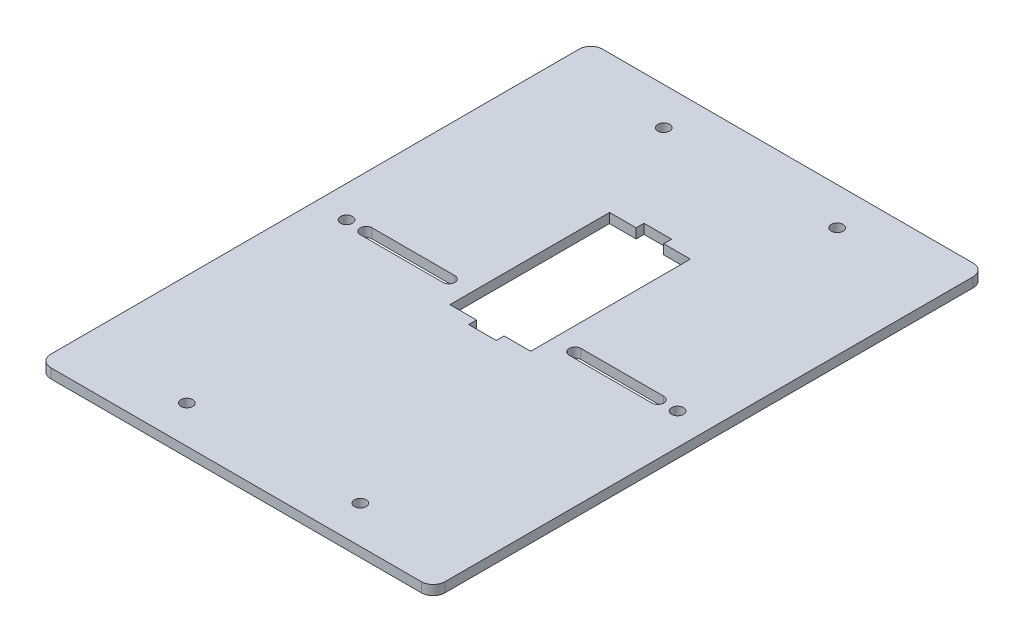
ISO-10303-21;
HEADER;
FILE_DESCRIPTION(('STEP AP214'),'2;1');
FILE_NAME('part.step','',(''),(''),'','','');
FILE_SCHEMA(('AUTOMOTIVE_DESIGN { 1 0 10303 214 1 1 1 1 }'));
ENDSEC;
DATA;
#1=APPLICATION_CONTEXT('core data for automotive mechanical design processes');
#2=APPLICATION_PROTOCOL_DEFINITION('international standard','automotive_design',2000,#1);
#3=PRODUCT_CONTEXT('',#1,'mechanical');
#4=PRODUCT('Part','Part','',(#3));
#5=PRODUCT_RELATED_PRODUCT_CATEGORY('part','',(#4));
#6=PRODUCT_DEFINITION_FORMATION('','',#4);
#7=PRODUCT_DEFINITION_CONTEXT('part definition',#1,'design');
#8=PRODUCT_DEFINITION('design','',#6,#7);
#9=PRODUCT_DEFINITION_SHAPE('','',#8);
#10=(LENGTH_UNIT() NAMED_UNIT(*) SI_UNIT(.MILLI.,.METRE.));
#11=(NAMED_UNIT(*) PLANE_ANGLE_UNIT() SI_UNIT($,.RADIAN.));
#12=(NAMED_UNIT(*) SI_UNIT($,.STERADIAN.) SOLID_ANGLE_UNIT());
#13=UNCERTAINTY_MEASURE_WITH_UNIT(LENGTH_MEASURE(1.E-05),#10,'distance_accuracy_value','');
#14=(GEOMETRIC_REPRESENTATION_CONTEXT(3) GLOBAL_UNCERTAINTY_ASSIGNED_CONTEXT((#13)) GLOBAL_UNIT_ASSIGNED_CONTEXT((#10,
#11,#12)) REPRESENTATION_CONTEXT('',''));
#15=CARTESIAN_POINT('',(0.,0.,0.));
#16=DIRECTION('',(0.,0.,1.));
#17=DIRECTION('',(1.,0.,0.));
#18=AXIS2_PLACEMENT_3D('',#15,#16,#17);
#19=CARTESIAN_POINT('',(47.,-2.45,67.));
#20=DIRECTION('',(0.,1.,0.));
#21=DIRECTION('',(0.,0.,1.));
#22=AXIS2_PLACEMENT_3D('',#19,#20,#21);
#23=CYLINDRICAL_SURFACE('',#22,3.);
#24=CARTESIAN_POINT('',(47.,0.,67.));
#25=DIRECTION('',(0.,1.,0.));
#26=DIRECTION('',(0.,0.,1.));
#27=AXIS2_PLACEMENT_3D('',#24,#25,#26);
#28=CIRCLE('',#27,3.);
#29=CARTESIAN_POINT('',(47.,0.,70.));
#30=VERTEX_POINT('',#29);
#31=CARTESIAN_POINT('',(50.,0.,67.));
#32=VERTEX_POINT('',#31);
#33=EDGE_CURVE('E393',#30,#32,#28,.T.);
#34=ORIENTED_EDGE('',*,*,#33,.F.);
#35=DIRECTION('',(0.,1.,0.));
#36=VECTOR('',#35,1.);
#37=CARTESIAN_POINT('',(47.,-2.45,70.));
#38=LINE('',#37,#36);
#39=CARTESIAN_POINT('',(47.,-2.45,70.));
#40=VERTEX_POINT('',#39);
#41=EDGE_CURVE('E11',#40,#30,#38,.T.);
#42=ORIENTED_EDGE('',*,*,#41,.F.);
#43=CARTESIAN_POINT('',(47.,-2.45,67.));
#44=DIRECTION('',(0.,1.,0.));
#45=DIRECTION('',(0.,0.,1.));
#46=AXIS2_PLACEMENT_3D('',#43,#44,#45);
#47=CIRCLE('',#46,3.);
#48=CARTESIAN_POINT('',(50.,-2.45,67.));
#49=VERTEX_POINT('',#48);
#50=EDGE_CURVE('E416',#40,#49,#47,.T.);
#51=ORIENTED_EDGE('',*,*,#50,.T.);
#52=DIRECTION('',(0.,1.,0.));
#53=VECTOR('',#52,1.);
#54=CARTESIAN_POINT('',(50.,-2.45,67.));
#55=LINE('',#54,#53);
#56=EDGE_CURVE('E39',#49,#32,#55,.T.);
#57=ORIENTED_EDGE('',*,*,#56,.T.);
#58=EDGE_LOOP('',(#34,#42,#51,#57));
#59=FACE_BOUND('',#58,.T.);
#60=ADVANCED_FACE('F36',(#59),#23,.T.);
#61=CARTESIAN_POINT('',(-47.,-2.45,70.));
#62=DIRECTION('',(0.,0.,1.));
#63=DIRECTION('',(1.,0.,0.));
#64=AXIS2_PLACEMENT_3D('',#61,#62,#63);
#65=PLANE('',#64);
#66=DIRECTION('',(1.,0.,0.));
#67=VECTOR('',#66,1.);
#68=CARTESIAN_POINT('',(-47.,0.,70.));
#69=LINE('',#68,#67);
#70=CARTESIAN_POINT('',(-47.,0.,70.));
#71=VERTEX_POINT('',#70);
#72=EDGE_CURVE('E420',#71,#30,#69,.T.);
#73=ORIENTED_EDGE('',*,*,#72,.F.);
#74=DIRECTION('',(0.,1.,0.));
#75=VECTOR('',#74,1.);
#76=CARTESIAN_POINT('',(-47.,-2.45,70.));
#77=LINE('',#76,#75);
#78=CARTESIAN_POINT('',(-47.,-2.45,70.));
#79=VERTEX_POINT('',#78);
#80=EDGE_CURVE('E44',#79,#71,#77,.T.);
#81=ORIENTED_EDGE('',*,*,#80,.F.);
#82=DIRECTION('',(1.,0.,0.));
#83=VECTOR('',#82,1.);
#84=CARTESIAN_POINT('',(-47.,-2.45,70.));
#85=LINE('',#84,#83);
#86=EDGE_CURVE('E438',#79,#40,#85,.T.);
#87=ORIENTED_EDGE('',*,*,#86,.T.);
#88=ORIENTED_EDGE('',*,*,#41,.T.);
#89=EDGE_LOOP('',(#73,#81,#87,#88));
#90=FACE_BOUND('',#89,.T.);
#91=ADVANCED_FACE('F485',(#90),#65,.T.);
#92=CARTESIAN_POINT('',(-47.,-2.45,67.));
#93=DIRECTION('',(0.,1.,0.));
#94=DIRECTION('',(0.,0.,1.));
#95=AXIS2_PLACEMENT_3D('',#92,#93,#94);
#96=CYLINDRICAL_SURFACE('',#95,3.);
#97=CARTESIAN_POINT('',(-47.,0.,67.));
#98=DIRECTION('',(0.,1.,0.));
#99=DIRECTION('',(0.,0.,-1.));
#100=AXIS2_PLACEMENT_3D('',#97,#98,#99);
#101=CIRCLE('',#100,3.);
#102=CARTESIAN_POINT('',(-50.,0.,67.));
#103=VERTEX_POINT('',#102);
#104=EDGE_CURVE('E458',#103,#71,#101,.T.);
#105=ORIENTED_EDGE('',*,*,#104,.F.);
#106=DIRECTION('',(0.,1.,0.));
#107=VECTOR('',#106,1.);
#108=CARTESIAN_POINT('',(-50.,-2.45,67.));
#109=LINE('',#108,#107);
#110=CARTESIAN_POINT('',(-50.,-2.45,67.));
#111=VERTEX_POINT('',#110);
#112=EDGE_CURVE('E464',#111,#103,#109,.T.);
#113=ORIENTED_EDGE('',*,*,#112,.F.);
#114=CARTESIAN_POINT('',(-47.,-2.45,67.));
#115=DIRECTION('',(0.,1.,0.));
#116=DIRECTION('',(0.,0.,-1.));
#117=AXIS2_PLACEMENT_3D('',#114,#115,#116);
#118=CIRCLE('',#117,3.);
#119=EDGE_CURVE('E435',#111,#79,#118,.T.);
#120=ORIENTED_EDGE('',*,*,#119,.T.);
#121=ORIENTED_EDGE('',*,*,#80,.T.);
#122=EDGE_LOOP('',(#105,#113,#120,#121));
#123=FACE_BOUND('',#122,.T.);
#124=ADVANCED_FACE('F505',(#123),#96,.T.);
#125=CARTESIAN_POINT('',(-50.,-2.45,67.));
#126=DIRECTION('',(-1.,0.,0.));
#127=DIRECTION('',(0.,0.,1.));
#128=AXIS2_PLACEMENT_3D('',#125,#126,#127);
#129=PLANE('',#128);
#130=DIRECTION('',(0.,0.,1.));
#131=VECTOR('',#130,1.);
#132=CARTESIAN_POINT('',(-50.,0.,67.));
#133=LINE('',#132,#131);
#134=CARTESIAN_POINT('',(-50.,0.,-67.));
#135=VERTEX_POINT('',#134);
#136=EDGE_CURVE('E455',#135,#103,#133,.T.);
#137=ORIENTED_EDGE('',*,*,#136,.F.);
#138=DIRECTION('',(0.,1.,0.));
#139=VECTOR('',#138,1.);
#140=CARTESIAN_POINT('',(-50.,-2.45,-67.));
#141=LINE('',#140,#139);
#142=CARTESIAN_POINT('',(-50.,-2.45,-67.));
#143=VERTEX_POINT('',#142);
#144=EDGE_CURVE('E466',#143,#135,#141,.T.);
#145=ORIENTED_EDGE('',*,*,#144,.F.);
#146=DIRECTION('',(0.,0.,1.));
#147=VECTOR('',#146,1.);
#148=CARTESIAN_POINT('',(-50.,-2.45,67.));
#149=LINE('',#148,#147);
#150=EDGE_CURVE('E432',#143,#111,#149,.T.);
#151=ORIENTED_EDGE('',*,*,#150,.T.);
#152=ORIENTED_EDGE('',*,*,#112,.T.);
#153=EDGE_LOOP('',(#137,#145,#151,#152));
#154=FACE_BOUND('',#153,.T.);
#155=ADVANCED_FACE('F503',(#154),#129,.T.);
#156=CARTESIAN_POINT('',(-47.,-2.45,-67.));
#157=DIRECTION('',(0.,1.,0.));
#158=DIRECTION('',(0.,0.,1.));
#159=AXIS2_PLACEMENT_3D('',#156,#157,#158);
#160=CYLINDRICAL_SURFACE('',#159,3.);
#161=CARTESIAN_POINT('',(-47.,0.,-67.));
#162=DIRECTION('',(0.,1.,0.));
#163=DIRECTION('',(0.,0.,-1.));
#164=AXIS2_PLACEMENT_3D('',#161,#162,#163);
#165=CIRCLE('',#164,3.);
#166=CARTESIAN_POINT('',(-47.,0.,-70.));
#167=VERTEX_POINT('',#166);
#168=EDGE_CURVE('E452',#167,#135,#165,.T.);
#169=ORIENTED_EDGE('',*,*,#168,.F.);
#170=DIRECTION('',(0.,1.,0.));
#171=VECTOR('',#170,1.);
#172=CARTESIAN_POINT('',(-47.,-2.45,-70.));
#173=LINE('',#172,#171);
#174=CARTESIAN_POINT('',(-47.,-2.45,-70.));
#175=VERTEX_POINT('',#174);
#176=EDGE_CURVE('E468',#175,#167,#173,.T.);
#177=ORIENTED_EDGE('',*,*,#176,.F.);
#178=CARTESIAN_POINT('',(-47.,-2.45,-67.));
#179=DIRECTION('',(0.,1.,0.));
#180=DIRECTION('',(0.,0.,-1.));
#181=AXIS2_PLACEMENT_3D('',#178,#179,#180);
#182=CIRCLE('',#181,3.);
#183=EDGE_CURVE('E429',#175,#143,#182,.T.);
#184=ORIENTED_EDGE('',*,*,#183,.T.);
#185=ORIENTED_EDGE('',*,*,#144,.T.);
#186=EDGE_LOOP('',(#169,#177,#184,#185));
#187=FACE_BOUND('',#186,.T.);
#188=ADVANCED_FACE('F499',(#187),#160,.T.);
#189=CARTESIAN_POINT('',(-47.,-2.45,-70.));
#190=DIRECTION('',(0.,0.,-1.));
#191=DIRECTION('',(-1.,0.,0.));
#192=AXIS2_PLACEMENT_3D('',#189,#190,#191);
#193=PLANE('',#192);
#194=DIRECTION('',(-1.,0.,0.));
#195=VECTOR('',#194,1.);
#196=CARTESIAN_POINT('',(-47.,0.,-70.));
#197=LINE('',#196,#195);
#198=CARTESIAN_POINT('',(47.,0.,-70.));
#199=VERTEX_POINT('',#198);
#200=EDGE_CURVE('E449',#199,#167,#197,.T.);
#201=ORIENTED_EDGE('',*,*,#200,.F.);
#202=DIRECTION('',(0.,1.,0.));
#203=VECTOR('',#202,1.);
#204=CARTESIAN_POINT('',(47.,-2.45,-70.));
#205=LINE('',#204,#203);
#206=CARTESIAN_POINT('',(47.,-2.45,-70.));
#207=VERTEX_POINT('',#206);
#208=EDGE_CURVE('E470',#207,#199,#205,.T.);
#209=ORIENTED_EDGE('',*,*,#208,.F.);
#210=DIRECTION('',(-1.,0.,0.));
#211=VECTOR('',#210,1.);
#212=CARTESIAN_POINT('',(-47.,-2.45,-70.));
#213=LINE('',#212,#211);
#214=EDGE_CURVE('E426',#207,#175,#213,.T.);
#215=ORIENTED_EDGE('',*,*,#214,.T.);
#216=ORIENTED_EDGE('',*,*,#176,.T.);
#217=EDGE_LOOP('',(#201,#209,#215,#216));
#218=FACE_BOUND('',#217,.T.);
#219=ADVANCED_FACE('F497',(#218),#193,.T.);
#220=CARTESIAN_POINT('',(47.,-2.45,-67.));
#221=DIRECTION('',(0.,1.,0.));
#222=DIRECTION('',(0.,0.,1.));
#223=AXIS2_PLACEMENT_3D('',#220,#221,#222);
#224=CYLINDRICAL_SURFACE('',#223,3.);
#225=CARTESIAN_POINT('',(47.,0.,-67.));
#226=DIRECTION('',(0.,1.,0.));
#227=DIRECTION('',(0.,0.,-1.));
#228=AXIS2_PLACEMENT_3D('',#225,#226,#227);
#229=CIRCLE('',#228,3.);
#230=CARTESIAN_POINT('',(50.,0.,-67.));
#231=VERTEX_POINT('',#230);
#232=EDGE_CURVE('E446',#231,#199,#229,.T.);
#233=ORIENTED_EDGE('',*,*,#232,.F.);
#234=DIRECTION('',(0.,1.,0.));
#235=VECTOR('',#234,1.);
#236=CARTESIAN_POINT('',(50.,-2.45,-67.));
#237=LINE('',#236,#235);
#238=CARTESIAN_POINT('',(50.,-2.45,-67.));
#239=VERTEX_POINT('',#238);
#240=EDGE_CURVE('E471',#239,#231,#237,.T.);
#241=ORIENTED_EDGE('',*,*,#240,.F.);
#242=CARTESIAN_POINT('',(47.,-2.45,-67.));
#243=DIRECTION('',(0.,1.,0.));
#244=DIRECTION('',(0.,0.,-1.));
#245=AXIS2_PLACEMENT_3D('',#242,#243,#244);
#246=CIRCLE('',#245,3.);
#247=EDGE_CURVE('E423',#239,#207,#246,.T.);
#248=ORIENTED_EDGE('',*,*,#247,.T.);
#249=ORIENTED_EDGE('',*,*,#208,.T.);
#250=EDGE_LOOP('',(#233,#241,#248,#249));
#251=FACE_BOUND('',#250,.T.);
#252=ADVANCED_FACE('F493',(#251),#224,.T.);
#253=CARTESIAN_POINT('',(50.,-2.45,67.));
#254=DIRECTION('',(1.,0.,0.));
#255=DIRECTION('',(0.,0.,-1.));
#256=AXIS2_PLACEMENT_3D('',#253,#254,#255);
#257=PLANE('',#256);
#258=DIRECTION('',(0.,0.,-1.));
#259=VECTOR('',#258,1.);
#260=CARTESIAN_POINT('',(50.,0.,67.));
#261=LINE('',#260,#259);
#262=EDGE_CURVE('E443',#32,#231,#261,.T.);
#263=ORIENTED_EDGE('',*,*,#262,.F.);
#264=ORIENTED_EDGE('',*,*,#56,.F.);
#265=DIRECTION('',(0.,0.,-1.));
#266=VECTOR('',#265,1.);
#267=CARTESIAN_POINT('',(50.,-2.45,67.));
#268=LINE('',#267,#266);
#269=EDGE_CURVE('E419',#49,#239,#268,.T.);
#270=ORIENTED_EDGE('',*,*,#269,.T.);
#271=ORIENTED_EDGE('',*,*,#240,.T.);
#272=EDGE_LOOP('',(#263,#264,#270,#271));
#273=FACE_BOUND('',#272,.T.);
#274=ADVANCED_FACE('F479',(#273),#257,.T.);
#275=CARTESIAN_POINT('',(47.,-2.45,67.));
#276=DIRECTION('',(0.,1.,0.));
#277=DIRECTION('',(0.,0.,1.));
#278=AXIS2_PLACEMENT_3D('',#275,#276,#277);
#279=PLANE('',#278);
#280=CARTESIAN_POINT('',(42.,-2.45,0.));
#281=DIRECTION('',(0.,1.,0.));
#282=DIRECTION('',(0.,0.,1.));
#283=AXIS2_PLACEMENT_3D('',#280,#281,#282);
#284=CIRCLE('',#283,1.5);
#285=CARTESIAN_POINT('',(42.,-2.45,1.5));
#286=VERTEX_POINT('',#285);
#287=EDGE_CURVE('E294',#286,#286,#284,.T.);
#288=ORIENTED_EDGE('',*,*,#287,.T.);
#289=EDGE_LOOP('',(#288));
#290=FACE_BOUND('',#289,.T.);
#291=CARTESIAN_POINT('',(-42.,-2.45,0.));
#292=DIRECTION('',(0.,1.,0.));
#293=DIRECTION('',(0.,0.,1.));
#294=AXIS2_PLACEMENT_3D('',#291,#292,#293);
#295=CIRCLE('',#294,1.5);
#296=CARTESIAN_POINT('',(-42.,-2.45,1.5));
#297=VERTEX_POINT('',#296);
#298=EDGE_CURVE('E301',#297,#297,#295,.T.);
#299=ORIENTED_EDGE('',*,*,#298,.T.);
#300=EDGE_LOOP('',(#299));
#301=FACE_BOUND('',#300,.T.);
#302=CARTESIAN_POINT('',(22.,-2.45,-60.5));
#303=DIRECTION('',(0.,1.,0.));
#304=DIRECTION('',(0.,0.,1.));
#305=AXIS2_PLACEMENT_3D('',#302,#303,#304);
#306=CIRCLE('',#305,1.5);
#307=CARTESIAN_POINT('',(22.,-2.45,-59.));
#308=VERTEX_POINT('',#307);
#309=EDGE_CURVE('E307',#308,#308,#306,.T.);
#310=ORIENTED_EDGE('',*,*,#309,.T.);
#311=EDGE_LOOP('',(#310));
#312=FACE_BOUND('',#311,.T.);
#313=CARTESIAN_POINT('',(-22.,-2.45,-60.5));
#314=DIRECTION('',(0.,1.,0.));
#315=DIRECTION('',(0.,0.,-1.));
#316=AXIS2_PLACEMENT_3D('',#313,#314,#315);
#317=CIRCLE('',#316,1.5);
#318=CARTESIAN_POINT('',(-22.,-2.45,-62.));
#319=VERTEX_POINT('',#318);
#320=EDGE_CURVE('E313',#319,#319,#317,.T.);
#321=ORIENTED_EDGE('',*,*,#320,.T.);
#322=EDGE_LOOP('',(#321));
#323=FACE_BOUND('',#322,.T.);
#324=CARTESIAN_POINT('',(22.,-2.45,60.5));
#325=DIRECTION('',(0.,1.,0.));
#326=DIRECTION('',(0.,0.,-1.));
#327=AXIS2_PLACEMENT_3D('',#324,#325,#326);
#328=CIRCLE('',#327,1.5);
#329=CARTESIAN_POINT('',(22.,-2.45,59.));
#330=VERTEX_POINT('',#329);
#331=EDGE_CURVE('E319',#330,#330,#328,.T.);
#332=ORIENTED_EDGE('',*,*,#331,.T.);
#333=EDGE_LOOP('',(#332));
#334=FACE_BOUND('',#333,.T.);
#335=CARTESIAN_POINT('',(-22.,-2.45,60.5));
#336=DIRECTION('',(0.,1.,0.));
#337=DIRECTION('',(0.,0.,1.));
#338=AXIS2_PLACEMENT_3D('',#335,#336,#337);
#339=CIRCLE('',#338,1.5);
#340=CARTESIAN_POINT('',(-22.,-2.45,62.));
#341=VERTEX_POINT('',#340);
#342=EDGE_CURVE('E966',#341,#341,#339,.T.);
#343=ORIENTED_EDGE('',*,*,#342,.T.);
#344=EDGE_LOOP('',(#343));
#345=FACE_BOUND('',#344,.T.);
#346=DIRECTION('',(-1.,0.,0.));
#347=VECTOR('',#346,1.);
#348=CARTESIAN_POINT('',(-37.,-2.45,-1.5));
#349=LINE('',#348,#347);
#350=CARTESIAN_POINT('',(-16.,-2.45,-1.5));
#351=VERTEX_POINT('',#350);
#352=CARTESIAN_POINT('',(-37.,-2.45,-1.5));
#353=VERTEX_POINT('',#352);
#354=EDGE_CURVE('E233',#351,#353,#349,.T.);
#355=ORIENTED_EDGE('',*,*,#354,.T.);
#356=CARTESIAN_POINT('',(-37.,-2.45,0.));
#357=DIRECTION('',(0.,1.,0.));
#358=DIRECTION('',(0.,0.,1.));
#359=AXIS2_PLACEMENT_3D('',#356,#357,#358);
#360=CIRCLE('',#359,1.5);
#361=CARTESIAN_POINT('',(-37.,-2.45,1.5));
#362=VERTEX_POINT('',#361);
#363=EDGE_CURVE('E225',#353,#362,#360,.T.);
#364=ORIENTED_EDGE('',*,*,#363,.T.);
#365=DIRECTION('',(1.,0.,0.));
#366=VECTOR('',#365,1.);
#367=CARTESIAN_POINT('',(-37.,-2.45,1.5));
#368=LINE('',#367,#366);
#369=CARTESIAN_POINT('',(-16.,-2.45,1.5));
#370=VERTEX_POINT('',#369);
#371=EDGE_CURVE('E236',#362,#370,#368,.T.);
#372=ORIENTED_EDGE('',*,*,#371,.T.);
#373=CARTESIAN_POINT('',(-16.,-2.45,0.));
#374=DIRECTION('',(0.,1.,0.));
#375=DIRECTION('',(0.,0.,1.));
#376=AXIS2_PLACEMENT_3D('',#373,#374,#375);
#377=CIRCLE('',#376,1.5);
#378=EDGE_CURVE('E52',#370,#351,#377,.T.);
#379=ORIENTED_EDGE('',*,*,#378,.T.);
#380=EDGE_LOOP('',(#355,#364,#372,#379));
#381=FACE_BOUND('',#380,.T.);
#382=DIRECTION('',(1.,0.,0.));
#383=VECTOR('',#382,1.);
#384=CARTESIAN_POINT('',(37.,-2.45,1.5));
#385=LINE('',#384,#383);
#386=CARTESIAN_POINT('',(16.,-2.45,1.5));
#387=VERTEX_POINT('',#386);
#388=CARTESIAN_POINT('',(37.,-2.45,1.5));
#389=VERTEX_POINT('',#388);
#390=EDGE_CURVE('E273',#387,#389,#385,.T.);
#391=ORIENTED_EDGE('',*,*,#390,.T.);
#392=CARTESIAN_POINT('',(37.,-2.45,0.));
#393=DIRECTION('',(0.,1.,0.));
#394=DIRECTION('',(0.,0.,-1.));
#395=AXIS2_PLACEMENT_3D('',#392,#393,#394);
#396=CIRCLE('',#395,1.5);
#397=CARTESIAN_POINT('',(37.,-2.45,-1.5));
#398=VERTEX_POINT('',#397);
#399=EDGE_CURVE('E265',#389,#398,#396,.T.);
#400=ORIENTED_EDGE('',*,*,#399,.T.);
#401=DIRECTION('',(-1.,0.,0.));
#402=VECTOR('',#401,1.);
#403=CARTESIAN_POINT('',(37.,-2.45,-1.5));
#404=LINE('',#403,#402);
#405=CARTESIAN_POINT('',(16.,-2.45,-1.5));
#406=VERTEX_POINT('',#405);
#407=EDGE_CURVE('E268',#398,#406,#404,.T.);
#408=ORIENTED_EDGE('',*,*,#407,.T.);
#409=CARTESIAN_POINT('',(16.,-2.45,0.));
#410=DIRECTION('',(0.,1.,0.));
#411=DIRECTION('',(0.,0.,-1.));
#412=AXIS2_PLACEMENT_3D('',#409,#410,#411);
#413=CIRCLE('',#412,1.5);
#414=EDGE_CURVE('E60',#406,#387,#413,.T.);
#415=ORIENTED_EDGE('',*,*,#414,.T.);
#416=EDGE_LOOP('',(#391,#400,#408,#415));
#417=FACE_BOUND('',#416,.T.);
#418=DIRECTION('',(0.,0.,-1.));
#419=VECTOR('',#418,1.);
#420=CARTESIAN_POINT('',(10.25,-2.45,5.5));
#421=LINE('',#420,#419);
#422=CARTESIAN_POINT('',(10.25,-2.45,5.5));
#423=VERTEX_POINT('',#422);
#424=CARTESIAN_POINT('',(10.25,-2.45,-35.));
#425=VERTEX_POINT('',#424);
#426=EDGE_CURVE('E354',#423,#425,#421,.T.);
#427=ORIENTED_EDGE('',*,*,#426,.T.);
#428=DIRECTION('',(-1.,0.,0.));
#429=VECTOR('',#428,1.);
#430=CARTESIAN_POINT('',(3.49999999999999,-2.45,-35.));
#431=LINE('',#430,#429);
#432=CARTESIAN_POINT('',(3.49999999999999,-2.45,-35.));
#433=VERTEX_POINT('',#432);
#434=EDGE_CURVE('E320',#425,#433,#431,.T.);
#435=ORIENTED_EDGE('',*,*,#434,.T.);
#436=DIRECTION('',(0.,0.,-1.));
#437=VECTOR('',#436,1.);
#438=CARTESIAN_POINT('',(3.5,-2.45,-37.));
#439=LINE('',#438,#437);
#440=CARTESIAN_POINT('',(3.5,-2.45,-37.));
#441=VERTEX_POINT('',#440);
#442=EDGE_CURVE('E323',#433,#441,#439,.T.);
#443=ORIENTED_EDGE('',*,*,#442,.T.);
#444=DIRECTION('',(-1.,0.,0.));
#445=VECTOR('',#444,1.);
#446=CARTESIAN_POINT('',(-3.50000000000001,-2.45,-37.));
#447=LINE('',#446,#445);
#448=CARTESIAN_POINT('',(-3.50000000000001,-2.45,-37.));
#449=VERTEX_POINT('',#448);
#450=EDGE_CURVE('E327',#441,#449,#447,.T.);
#451=ORIENTED_EDGE('',*,*,#450,.T.);
#452=DIRECTION('',(0.,0.,1.));
#453=VECTOR('',#452,1.);
#454=CARTESIAN_POINT('',(-3.50000000000001,-2.45,-35.));
#455=LINE('',#454,#453);
#456=CARTESIAN_POINT('',(-3.50000000000001,-2.45,-35.));
#457=VERTEX_POINT('',#456);
#458=EDGE_CURVE('E330',#449,#457,#455,.T.);
#459=ORIENTED_EDGE('',*,*,#458,.T.);
#460=DIRECTION('',(-1.,0.,0.));
#461=VECTOR('',#460,1.);
#462=CARTESIAN_POINT('',(-10.25,-2.45,-35.));
#463=LINE('',#462,#461);
#464=CARTESIAN_POINT('',(-10.25,-2.45,-35.));
#465=VERTEX_POINT('',#464);
#466=EDGE_CURVE('E333',#457,#465,#463,.T.);
#467=ORIENTED_EDGE('',*,*,#466,.T.);
#468=DIRECTION('',(0.,0.,1.));
#469=VECTOR('',#468,1.);
#470=CARTESIAN_POINT('',(-10.25,-2.45,5.5));
#471=LINE('',#470,#469);
#472=CARTESIAN_POINT('',(-10.25,-2.45,5.5));
#473=VERTEX_POINT('',#472);
#474=EDGE_CURVE('E336',#465,#473,#471,.T.);
#475=ORIENTED_EDGE('',*,*,#474,.T.);
#476=DIRECTION('',(1.,0.,0.));
#477=VECTOR('',#476,1.);
#478=CARTESIAN_POINT('',(-10.25,-2.45,5.5));
#479=LINE('',#478,#477);
#480=CARTESIAN_POINT('',(-3.5,-2.45,5.50000000000001));
#481=VERTEX_POINT('',#480);
#482=EDGE_CURVE('E339',#473,#481,#479,.T.);
#483=ORIENTED_EDGE('',*,*,#482,.T.);
#484=DIRECTION('',(0.,0.,1.));
#485=VECTOR('',#484,1.);
#486=CARTESIAN_POINT('',(-3.5,-2.45,5.50000000000001));
#487=LINE('',#486,#485);
#488=CARTESIAN_POINT('',(-3.5,-2.45,7.50000000000001));
#489=VERTEX_POINT('',#488);
#490=EDGE_CURVE('E342',#481,#489,#487,.T.);
#491=ORIENTED_EDGE('',*,*,#490,.T.);
#492=DIRECTION('',(1.,0.,0.));
#493=VECTOR('',#492,1.);
#494=CARTESIAN_POINT('',(-3.5,-2.45,7.50000000000001));
#495=LINE('',#494,#493);
#496=CARTESIAN_POINT('',(3.50000000000001,-2.45,7.5));
#497=VERTEX_POINT('',#496);
#498=EDGE_CURVE('E345',#489,#497,#495,.T.);
#499=ORIENTED_EDGE('',*,*,#498,.T.);
#500=DIRECTION('',(0.,0.,-1.));
#501=VECTOR('',#500,1.);
#502=CARTESIAN_POINT('',(3.50000000000001,-2.45,7.5));
#503=LINE('',#502,#501);
#504=CARTESIAN_POINT('',(3.5,-2.45,5.5));
#505=VERTEX_POINT('',#504);
#506=EDGE_CURVE('E348',#497,#505,#503,.T.);
#507=ORIENTED_EDGE('',*,*,#506,.T.);
#508=DIRECTION('',(1.,0.,0.));
#509=VECTOR('',#508,1.);
#510=CARTESIAN_POINT('',(3.5,-2.45,5.5));
#511=LINE('',#510,#509);
#512=EDGE_CURVE('E351',#505,#423,#511,.T.);
#513=ORIENTED_EDGE('',*,*,#512,.T.);
#514=EDGE_LOOP('',(#427,#435,#443,#451,#459,#467,#475,#483,#491,#499,#507,#513));
#515=FACE_BOUND('',#514,.T.);
#516=ORIENTED_EDGE('',*,*,#50,.F.);
#517=ORIENTED_EDGE('',*,*,#86,.F.);
#518=ORIENTED_EDGE('',*,*,#119,.F.);
#519=ORIENTED_EDGE('',*,*,#150,.F.);
#520=ORIENTED_EDGE('',*,*,#183,.F.);
#521=ORIENTED_EDGE('',*,*,#214,.F.);
#522=ORIENTED_EDGE('',*,*,#247,.F.);
#523=ORIENTED_EDGE('',*,*,#269,.F.);
#524=EDGE_LOOP('',(#516,#517,#518,#519,#520,#521,#522,#523));
#525=FACE_BOUND('',#524,.T.);
#526=ADVANCED_FACE('F240',(#290,#301,#312,#323,#334,#345,#381,#417,#515,#525),#279,.F.);
#527=CARTESIAN_POINT('',(47.,0.,67.));
#528=DIRECTION('',(0.,1.,0.));
#529=DIRECTION('',(0.,0.,1.));
#530=AXIS2_PLACEMENT_3D('',#527,#528,#529);
#531=PLANE('',#530);
#532=CARTESIAN_POINT('',(42.,0.,0.));
#533=DIRECTION('',(0.,1.,0.));
#534=DIRECTION('',(0.,0.,1.));
#535=AXIS2_PLACEMENT_3D('',#532,#533,#534);
#536=CIRCLE('',#535,1.5);
#537=CARTESIAN_POINT('',(42.,0.,1.5));
#538=VERTEX_POINT('',#537);
#539=EDGE_CURVE('E298',#538,#538,#536,.T.);
#540=ORIENTED_EDGE('',*,*,#539,.F.);
#541=EDGE_LOOP('',(#540));
#542=FACE_BOUND('',#541,.T.);
#543=CARTESIAN_POINT('',(-42.,0.,0.));
#544=DIRECTION('',(0.,1.,0.));
#545=DIRECTION('',(0.,0.,1.));
#546=AXIS2_PLACEMENT_3D('',#543,#544,#545);
#547=CIRCLE('',#546,1.5);
#548=CARTESIAN_POINT('',(-42.,0.,1.5));
#549=VERTEX_POINT('',#548);
#550=EDGE_CURVE('E304',#549,#549,#547,.T.);
#551=ORIENTED_EDGE('',*,*,#550,.F.);
#552=EDGE_LOOP('',(#551));
#553=FACE_BOUND('',#552,.T.);
#554=CARTESIAN_POINT('',(22.,0.,-60.5));
#555=DIRECTION('',(0.,1.,0.));
#556=DIRECTION('',(0.,0.,1.));
#557=AXIS2_PLACEMENT_3D('',#554,#555,#556);
#558=CIRCLE('',#557,1.5);
#559=CARTESIAN_POINT('',(22.,0.,-59.));
#560=VERTEX_POINT('',#559);
#561=EDGE_CURVE('E310',#560,#560,#558,.T.);
#562=ORIENTED_EDGE('',*,*,#561,.F.);
#563=EDGE_LOOP('',(#562));
#564=FACE_BOUND('',#563,.T.);
#565=CARTESIAN_POINT('',(-22.,0.,-60.5));
#566=DIRECTION('',(0.,1.,0.));
#567=DIRECTION('',(0.,0.,-1.));
#568=AXIS2_PLACEMENT_3D('',#565,#566,#567);
#569=CIRCLE('',#568,1.5);
#570=CARTESIAN_POINT('',(-22.,0.,-62.));
#571=VERTEX_POINT('',#570);
#572=EDGE_CURVE('E316',#571,#571,#569,.T.);
#573=ORIENTED_EDGE('',*,*,#572,.F.);
#574=EDGE_LOOP('',(#573));
#575=FACE_BOUND('',#574,.T.);
#576=CARTESIAN_POINT('',(22.,0.,60.5));
#577=DIRECTION('',(0.,1.,0.));
#578=DIRECTION('',(0.,0.,-1.));
#579=AXIS2_PLACEMENT_3D('',#576,#577,#578);
#580=CIRCLE('',#579,1.5);
#581=CARTESIAN_POINT('',(22.,0.,59.));
#582=VERTEX_POINT('',#581);
#583=EDGE_CURVE('E925',#582,#582,#580,.T.);
#584=ORIENTED_EDGE('',*,*,#583,.F.);
#585=EDGE_LOOP('',(#584));
#586=FACE_BOUND('',#585,.T.);
#587=CARTESIAN_POINT('',(-22.,0.,60.5));
#588=DIRECTION('',(0.,1.,0.));
#589=DIRECTION('',(0.,0.,1.));
#590=AXIS2_PLACEMENT_3D('',#587,#588,#589);
#591=CIRCLE('',#590,1.5);
#592=CARTESIAN_POINT('',(-22.,0.,62.));
#593=VERTEX_POINT('',#592);
#594=EDGE_CURVE('E249',#593,#593,#591,.T.);
#595=ORIENTED_EDGE('',*,*,#594,.F.);
#596=EDGE_LOOP('',(#595));
#597=FACE_BOUND('',#596,.T.);
#598=CARTESIAN_POINT('',(-37.,0.,0.));
#599=DIRECTION('',(0.,1.,0.));
#600=DIRECTION('',(0.,0.,1.));
#601=AXIS2_PLACEMENT_3D('',#598,#599,#600);
#602=CIRCLE('',#601,1.5);
#603=CARTESIAN_POINT('',(-37.,0.,-1.5));
#604=VERTEX_POINT('',#603);
#605=CARTESIAN_POINT('',(-37.,0.,1.5));
#606=VERTEX_POINT('',#605);
#607=EDGE_CURVE('E228',#604,#606,#602,.T.);
#608=ORIENTED_EDGE('',*,*,#607,.F.);
#609=DIRECTION('',(-1.,0.,0.));
#610=VECTOR('',#609,1.);
#611=CARTESIAN_POINT('',(-37.,0.,-1.5));
#612=LINE('',#611,#610);
#613=CARTESIAN_POINT('',(-16.,0.,-1.5));
#614=VERTEX_POINT('',#613);
#615=EDGE_CURVE('E243',#614,#604,#612,.T.);
#616=ORIENTED_EDGE('',*,*,#615,.F.);
#617=CARTESIAN_POINT('',(-16.,0.,0.));
#618=DIRECTION('',(0.,1.,0.));
#619=DIRECTION('',(0.,0.,1.));
#620=AXIS2_PLACEMENT_3D('',#617,#618,#619);
#621=CIRCLE('',#620,1.5);
#622=CARTESIAN_POINT('',(-16.,0.,1.5));
#623=VERTEX_POINT('',#622);
#624=EDGE_CURVE('E246',#623,#614,#621,.T.);
#625=ORIENTED_EDGE('',*,*,#624,.F.);
#626=DIRECTION('',(1.,0.,0.));
#627=VECTOR('',#626,1.);
#628=CARTESIAN_POINT('',(-37.,0.,1.5));
#629=LINE('',#628,#627);
#630=EDGE_CURVE('E255',#606,#623,#629,.T.);
#631=ORIENTED_EDGE('',*,*,#630,.F.);
#632=EDGE_LOOP('',(#608,#616,#625,#631));
#633=FACE_BOUND('',#632,.T.);
#634=CARTESIAN_POINT('',(37.,0.,0.));
#635=DIRECTION('',(0.,1.,0.));
#636=DIRECTION('',(0.,0.,-1.));
#637=AXIS2_PLACEMENT_3D('',#634,#635,#636);
#638=CIRCLE('',#637,1.5);
#639=CARTESIAN_POINT('',(37.,0.,1.5));
#640=VERTEX_POINT('',#639);
#641=CARTESIAN_POINT('',(37.,0.,-1.5));
#642=VERTEX_POINT('',#641);
#643=EDGE_CURVE('E277',#640,#642,#638,.T.);
#644=ORIENTED_EDGE('',*,*,#643,.F.);
#645=DIRECTION('',(1.,0.,0.));
#646=VECTOR('',#645,1.);
#647=CARTESIAN_POINT('',(37.,0.,1.5));
#648=LINE('',#647,#646);
#649=CARTESIAN_POINT('',(16.,0.,1.5));
#650=VERTEX_POINT('',#649);
#651=EDGE_CURVE('E269',#650,#640,#648,.T.);
#652=ORIENTED_EDGE('',*,*,#651,.F.);
#653=CARTESIAN_POINT('',(16.,0.,0.));
#654=DIRECTION('',(0.,1.,0.));
#655=DIRECTION('',(0.,0.,-1.));
#656=AXIS2_PLACEMENT_3D('',#653,#654,#655);
#657=CIRCLE('',#656,1.5);
#658=CARTESIAN_POINT('',(16.,0.,-1.5));
#659=VERTEX_POINT('',#658);
#660=EDGE_CURVE('E282',#659,#650,#657,.T.);
#661=ORIENTED_EDGE('',*,*,#660,.F.);
#662=DIRECTION('',(-1.,0.,0.));
#663=VECTOR('',#662,1.);
#664=CARTESIAN_POINT('',(37.,0.,-1.5));
#665=LINE('',#664,#663);
#666=EDGE_CURVE('E279',#642,#659,#665,.T.);
#667=ORIENTED_EDGE('',*,*,#666,.F.);
#668=EDGE_LOOP('',(#644,#652,#661,#667));
#669=FACE_BOUND('',#668,.T.);
#670=DIRECTION('',(-1.,0.,0.));
#671=VECTOR('',#670,1.);
#672=CARTESIAN_POINT('',(3.49999999999999,0.,-35.));
#673=LINE('',#672,#671);
#674=CARTESIAN_POINT('',(10.25,0.,-35.));
#675=VERTEX_POINT('',#674);
#676=CARTESIAN_POINT('',(3.5,0.,-35.));
#677=VERTEX_POINT('',#676);
#678=EDGE_CURVE('E297',#675,#677,#673,.T.);
#679=ORIENTED_EDGE('',*,*,#678,.F.);
#680=DIRECTION('',(0.,0.,-1.));
#681=VECTOR('',#680,1.);
#682=CARTESIAN_POINT('',(10.25,0.,5.5));
#683=LINE('',#682,#681);
#684=CARTESIAN_POINT('',(10.25,0.,5.5));
#685=VERTEX_POINT('',#684);
#686=EDGE_CURVE('E324',#685,#675,#683,.T.);
#687=ORIENTED_EDGE('',*,*,#686,.F.);
#688=DIRECTION('',(1.,0.,0.));
#689=VECTOR('',#688,1.);
#690=CARTESIAN_POINT('',(3.5,0.,5.5));
#691=LINE('',#690,#689);
#692=CARTESIAN_POINT('',(3.5,0.,5.5));
#693=VERTEX_POINT('',#692);
#694=EDGE_CURVE('E386',#693,#685,#691,.T.);
#695=ORIENTED_EDGE('',*,*,#694,.F.);
#696=DIRECTION('',(0.,0.,-1.));
#697=VECTOR('',#696,1.);
#698=CARTESIAN_POINT('',(3.50000000000001,0.,7.5));
#699=LINE('',#698,#697);
#700=CARTESIAN_POINT('',(3.50000000000001,0.,7.5));
#701=VERTEX_POINT('',#700);
#702=EDGE_CURVE('E383',#701,#693,#699,.T.);
#703=ORIENTED_EDGE('',*,*,#702,.F.);
#704=DIRECTION('',(1.,0.,0.));
#705=VECTOR('',#704,1.);
#706=CARTESIAN_POINT('',(-3.5,0.,7.50000000000001));
#707=LINE('',#706,#705);
#708=CARTESIAN_POINT('',(-3.5,0.,7.50000000000001));
#709=VERTEX_POINT('',#708);
#710=EDGE_CURVE('E380',#709,#701,#707,.T.);
#711=ORIENTED_EDGE('',*,*,#710,.F.);
#712=DIRECTION('',(0.,0.,1.));
#713=VECTOR('',#712,1.);
#714=CARTESIAN_POINT('',(-3.5,0.,5.50000000000001));
#715=LINE('',#714,#713);
#716=CARTESIAN_POINT('',(-3.5,0.,5.50000000000001));
#717=VERTEX_POINT('',#716);
#718=EDGE_CURVE('E377',#717,#709,#715,.T.);
#719=ORIENTED_EDGE('',*,*,#718,.F.);
#720=DIRECTION('',(1.,0.,0.));
#721=VECTOR('',#720,1.);
#722=CARTESIAN_POINT('',(-10.25,0.,5.5));
#723=LINE('',#722,#721);
#724=CARTESIAN_POINT('',(-10.25,0.,5.5));
#725=VERTEX_POINT('',#724);
#726=EDGE_CURVE('E374',#725,#717,#723,.T.);
#727=ORIENTED_EDGE('',*,*,#726,.F.);
#728=DIRECTION('',(0.,0.,1.));
#729=VECTOR('',#728,1.);
#730=CARTESIAN_POINT('',(-10.25,0.,5.5));
#731=LINE('',#730,#729);
#732=CARTESIAN_POINT('',(-10.25,0.,-35.));
#733=VERTEX_POINT('',#732);
#734=EDGE_CURVE('E371',#733,#725,#731,.T.);
#735=ORIENTED_EDGE('',*,*,#734,.F.);
#736=DIRECTION('',(-1.,0.,0.));
#737=VECTOR('',#736,1.);
#738=CARTESIAN_POINT('',(-10.25,0.,-35.));
#739=LINE('',#738,#737);
#740=CARTESIAN_POINT('',(-3.50000000000001,0.,-35.));
#741=VERTEX_POINT('',#740);
#742=EDGE_CURVE('E368',#741,#733,#739,.T.);
#743=ORIENTED_EDGE('',*,*,#742,.F.);
#744=DIRECTION('',(0.,0.,1.));
#745=VECTOR('',#744,1.);
#746=CARTESIAN_POINT('',(-3.50000000000001,0.,-35.));
#747=LINE('',#746,#745);
#748=CARTESIAN_POINT('',(-3.50000000000001,0.,-37.));
#749=VERTEX_POINT('',#748);
#750=EDGE_CURVE('E365',#749,#741,#747,.T.);
#751=ORIENTED_EDGE('',*,*,#750,.F.);
#752=DIRECTION('',(-1.,0.,0.));
#753=VECTOR('',#752,1.);
#754=CARTESIAN_POINT('',(-3.50000000000001,0.,-37.));
#755=LINE('',#754,#753);
#756=CARTESIAN_POINT('',(3.5,0.,-37.));
#757=VERTEX_POINT('',#756);
#758=EDGE_CURVE('E362',#757,#749,#755,.T.);
#759=ORIENTED_EDGE('',*,*,#758,.F.);
#760=DIRECTION('',(0.,0.,-1.));
#761=VECTOR('',#760,1.);
#762=CARTESIAN_POINT('',(3.5,0.,-37.));
#763=LINE('',#762,#761);
#764=EDGE_CURVE('E359',#677,#757,#763,.T.);
#765=ORIENTED_EDGE('',*,*,#764,.F.);
#766=EDGE_LOOP('',(#679,#687,#695,#703,#711,#719,#727,#735,#743,#751,#759,#765));
#767=FACE_BOUND('',#766,.T.);
#768=ORIENTED_EDGE('',*,*,#33,.T.);
#769=ORIENTED_EDGE('',*,*,#262,.T.);
#770=ORIENTED_EDGE('',*,*,#232,.T.);
#771=ORIENTED_EDGE('',*,*,#200,.T.);
#772=ORIENTED_EDGE('',*,*,#168,.T.);
#773=ORIENTED_EDGE('',*,*,#136,.T.);
#774=ORIENTED_EDGE('',*,*,#104,.T.);
#775=ORIENTED_EDGE('',*,*,#72,.T.);
#776=EDGE_LOOP('',(#768,#769,#770,#771,#772,#773,#774,#775));
#777=FACE_BOUND('',#776,.T.);
#778=ADVANCED_FACE('F481',(#542,#553,#564,#575,#586,#597,#633,#669,#767,#777),#531,.T.);
#779=CARTESIAN_POINT('',(3.49999999999999,-2.45,-35.));
#780=DIRECTION('',(0.,0.,-1.));
#781=DIRECTION('',(-1.,0.,0.));
#782=AXIS2_PLACEMENT_3D('',#779,#780,#781);
#783=PLANE('',#782);
#784=ORIENTED_EDGE('',*,*,#678,.T.);
#785=DIRECTION('',(0.,1.,0.));
#786=VECTOR('',#785,1.);
#787=CARTESIAN_POINT('',(3.49999999999999,-2.45,-35.));
#788=LINE('',#787,#786);
#789=EDGE_CURVE('E357',#433,#677,#788,.T.);
#790=ORIENTED_EDGE('',*,*,#789,.F.);
#791=ORIENTED_EDGE('',*,*,#434,.F.);
#792=DIRECTION('',(0.,1.,0.));
#793=VECTOR('',#792,1.);
#794=CARTESIAN_POINT('',(10.25,-2.45,-35.));
#795=LINE('',#794,#793);
#796=EDGE_CURVE('E391',#425,#675,#795,.T.);
#797=ORIENTED_EDGE('',*,*,#796,.T.);
#798=EDGE_LOOP('',(#784,#790,#791,#797));
#799=FACE_BOUND('',#798,.T.);
#800=ADVANCED_FACE('F588',(#799),#783,.F.);
#801=CARTESIAN_POINT('',(10.25,-2.45,5.5));
#802=DIRECTION('',(1.,0.,0.));
#803=DIRECTION('',(0.,0.,-1.));
#804=AXIS2_PLACEMENT_3D('',#801,#802,#803);
#805=PLANE('',#804);
#806=ORIENTED_EDGE('',*,*,#686,.T.);
#807=ORIENTED_EDGE('',*,*,#796,.F.);
#808=ORIENTED_EDGE('',*,*,#426,.F.);
#809=DIRECTION('',(0.,1.,0.));
#810=VECTOR('',#809,1.);
#811=CARTESIAN_POINT('',(10.25,-2.45,5.5));
#812=LINE('',#811,#810);
#813=EDGE_CURVE('E394',#423,#685,#812,.T.);
#814=ORIENTED_EDGE('',*,*,#813,.T.);
#815=EDGE_LOOP('',(#806,#807,#808,#814));
#816=FACE_BOUND('',#815,.T.);
#817=ADVANCED_FACE('F599',(#816),#805,.F.);
#818=CARTESIAN_POINT('',(3.5,-2.45,5.5));
#819=DIRECTION('',(0.,0.,1.));
#820=DIRECTION('',(1.,0.,0.));
#821=AXIS2_PLACEMENT_3D('',#818,#819,#820);
#822=PLANE('',#821);
#823=ORIENTED_EDGE('',*,*,#694,.T.);
#824=ORIENTED_EDGE('',*,*,#813,.F.);
#825=ORIENTED_EDGE('',*,*,#512,.F.);
#826=DIRECTION('',(0.,1.,0.));
#827=VECTOR('',#826,1.);
#828=CARTESIAN_POINT('',(3.5,-2.45,5.5));
#829=LINE('',#828,#827);
#830=EDGE_CURVE('E396',#505,#693,#829,.T.);
#831=ORIENTED_EDGE('',*,*,#830,.T.);
#832=EDGE_LOOP('',(#823,#824,#825,#831));
#833=FACE_BOUND('',#832,.T.);
#834=ADVANCED_FACE('F610',(#833),#822,.F.);
#835=CARTESIAN_POINT('',(3.50000000000001,-2.45,7.5));
#836=DIRECTION('',(1.,0.,0.));
#837=DIRECTION('',(0.,0.,-1.));
#838=AXIS2_PLACEMENT_3D('',#835,#836,#837);
#839=PLANE('',#838);
#840=ORIENTED_EDGE('',*,*,#702,.T.);
#841=ORIENTED_EDGE('',*,*,#830,.F.);
#842=ORIENTED_EDGE('',*,*,#506,.F.);
#843=DIRECTION('',(0.,1.,0.));
#844=VECTOR('',#843,1.);
#845=CARTESIAN_POINT('',(3.50000000000001,-2.45,7.5));
#846=LINE('',#845,#844);
#847=EDGE_CURVE('E398',#497,#701,#846,.T.);
#848=ORIENTED_EDGE('',*,*,#847,.T.);
#849=EDGE_LOOP('',(#840,#841,#842,#848));
#850=FACE_BOUND('',#849,.T.);
#851=ADVANCED_FACE('F621',(#850),#839,.F.);
#852=CARTESIAN_POINT('',(-3.5,-2.45,7.50000000000001));
#853=DIRECTION('',(0.,0.,1.));
#854=DIRECTION('',(1.,0.,0.));
#855=AXIS2_PLACEMENT_3D('',#852,#853,#854);
#856=PLANE('',#855);
#857=ORIENTED_EDGE('',*,*,#710,.T.);
#858=ORIENTED_EDGE('',*,*,#847,.F.);
#859=ORIENTED_EDGE('',*,*,#498,.F.);
#860=DIRECTION('',(0.,1.,0.));
#861=VECTOR('',#860,1.);
#862=CARTESIAN_POINT('',(-3.5,-2.45,7.50000000000001));
#863=LINE('',#862,#861);
#864=EDGE_CURVE('E400',#489,#709,#863,.T.);
#865=ORIENTED_EDGE('',*,*,#864,.T.);
#866=EDGE_LOOP('',(#857,#858,#859,#865));
#867=FACE_BOUND('',#866,.T.);
#868=ADVANCED_FACE('F632',(#867),#856,.F.);
#869=CARTESIAN_POINT('',(-3.5,-2.45,5.50000000000001));
#870=DIRECTION('',(-1.,0.,0.));
#871=DIRECTION('',(0.,0.,1.));
#872=AXIS2_PLACEMENT_3D('',#869,#870,#871);
#873=PLANE('',#872);
#874=ORIENTED_EDGE('',*,*,#718,.T.);
#875=ORIENTED_EDGE('',*,*,#864,.F.);
#876=ORIENTED_EDGE('',*,*,#490,.F.);
#877=DIRECTION('',(0.,1.,0.));
#878=VECTOR('',#877,1.);
#879=CARTESIAN_POINT('',(-3.5,-2.45,5.50000000000001));
#880=LINE('',#879,#878);
#881=EDGE_CURVE('E402',#481,#717,#880,.T.);
#882=ORIENTED_EDGE('',*,*,#881,.T.);
#883=EDGE_LOOP('',(#874,#875,#876,#882));
#884=FACE_BOUND('',#883,.T.);
#885=ADVANCED_FACE('F643',(#884),#873,.F.);
#886=CARTESIAN_POINT('',(-10.25,-2.45,5.5));
#887=DIRECTION('',(0.,0.,1.));
#888=DIRECTION('',(1.,0.,0.));
#889=AXIS2_PLACEMENT_3D('',#886,#887,#888);
#890=PLANE('',#889);
#891=ORIENTED_EDGE('',*,*,#726,.T.);
#892=ORIENTED_EDGE('',*,*,#881,.F.);
#893=ORIENTED_EDGE('',*,*,#482,.F.);
#894=DIRECTION('',(0.,1.,0.));
#895=VECTOR('',#894,1.);
#896=CARTESIAN_POINT('',(-10.25,-2.45,5.5));
#897=LINE('',#896,#895);
#898=EDGE_CURVE('E404',#473,#725,#897,.T.);
#899=ORIENTED_EDGE('',*,*,#898,.T.);
#900=EDGE_LOOP('',(#891,#892,#893,#899));
#901=FACE_BOUND('',#900,.T.);
#902=ADVANCED_FACE('F654',(#901),#890,.F.);
#903=CARTESIAN_POINT('',(-10.25,-2.45,5.5));
#904=DIRECTION('',(-1.,0.,0.));
#905=DIRECTION('',(0.,0.,1.));
#906=AXIS2_PLACEMENT_3D('',#903,#904,#905);
#907=PLANE('',#906);
#908=ORIENTED_EDGE('',*,*,#734,.T.);
#909=ORIENTED_EDGE('',*,*,#898,.F.);
#910=ORIENTED_EDGE('',*,*,#474,.F.);
#911=DIRECTION('',(0.,1.,0.));
#912=VECTOR('',#911,1.);
#913=CARTESIAN_POINT('',(-10.25,-2.45,-35.));
#914=LINE('',#913,#912);
#915=EDGE_CURVE('E406',#465,#733,#914,.T.);
#916=ORIENTED_EDGE('',*,*,#915,.T.);
#917=EDGE_LOOP('',(#908,#909,#910,#916));
#918=FACE_BOUND('',#917,.T.);
#919=ADVANCED_FACE('F665',(#918),#907,.F.);
#920=CARTESIAN_POINT('',(-10.25,-2.45,-35.));
#921=DIRECTION('',(0.,0.,-1.));
#922=DIRECTION('',(-1.,0.,0.));
#923=AXIS2_PLACEMENT_3D('',#920,#921,#922);
#924=PLANE('',#923);
#925=ORIENTED_EDGE('',*,*,#742,.T.);
#926=ORIENTED_EDGE('',*,*,#915,.F.);
#927=ORIENTED_EDGE('',*,*,#466,.F.);
#928=DIRECTION('',(0.,1.,0.));
#929=VECTOR('',#928,1.);
#930=CARTESIAN_POINT('',(-3.50000000000001,-2.45,-35.));
#931=LINE('',#930,#929);
#932=EDGE_CURVE('E408',#457,#741,#931,.T.);
#933=ORIENTED_EDGE('',*,*,#932,.T.);
#934=EDGE_LOOP('',(#925,#926,#927,#933));
#935=FACE_BOUND('',#934,.T.);
#936=ADVANCED_FACE('F676',(#935),#924,.F.);
#937=CARTESIAN_POINT('',(-3.50000000000001,-2.45,-35.));
#938=DIRECTION('',(-1.,0.,0.));
#939=DIRECTION('',(0.,0.,1.));
#940=AXIS2_PLACEMENT_3D('',#937,#938,#939);
#941=PLANE('',#940);
#942=ORIENTED_EDGE('',*,*,#750,.T.);
#943=ORIENTED_EDGE('',*,*,#932,.F.);
#944=ORIENTED_EDGE('',*,*,#458,.F.);
#945=DIRECTION('',(0.,1.,0.));
#946=VECTOR('',#945,1.);
#947=CARTESIAN_POINT('',(-3.50000000000001,-2.45,-37.));
#948=LINE('',#947,#946);
#949=EDGE_CURVE('E410',#449,#749,#948,.T.);
#950=ORIENTED_EDGE('',*,*,#949,.T.);
#951=EDGE_LOOP('',(#942,#943,#944,#950));
#952=FACE_BOUND('',#951,.T.);
#953=ADVANCED_FACE('F687',(#952),#941,.F.);
#954=CARTESIAN_POINT('',(-3.50000000000001,-2.45,-37.));
#955=DIRECTION('',(0.,0.,-1.));
#956=DIRECTION('',(-1.,0.,0.));
#957=AXIS2_PLACEMENT_3D('',#954,#955,#956);
#958=PLANE('',#957);
#959=ORIENTED_EDGE('',*,*,#758,.T.);
#960=ORIENTED_EDGE('',*,*,#949,.F.);
#961=ORIENTED_EDGE('',*,*,#450,.F.);
#962=DIRECTION('',(0.,1.,0.));
#963=VECTOR('',#962,1.);
#964=CARTESIAN_POINT('',(3.5,-2.45,-37.));
#965=LINE('',#964,#963);
#966=EDGE_CURVE('E412',#441,#757,#965,.T.);
#967=ORIENTED_EDGE('',*,*,#966,.T.);
#968=EDGE_LOOP('',(#959,#960,#961,#967));
#969=FACE_BOUND('',#968,.T.);
#970=ADVANCED_FACE('F698',(#969),#958,.F.);
#971=CARTESIAN_POINT('',(3.5,-2.45,-37.));
#972=DIRECTION('',(1.,0.,0.));
#973=DIRECTION('',(0.,0.,-1.));
#974=AXIS2_PLACEMENT_3D('',#971,#972,#973);
#975=PLANE('',#974);
#976=ORIENTED_EDGE('',*,*,#764,.T.);
#977=ORIENTED_EDGE('',*,*,#966,.F.);
#978=ORIENTED_EDGE('',*,*,#442,.F.);
#979=ORIENTED_EDGE('',*,*,#789,.T.);
#980=EDGE_LOOP('',(#976,#977,#978,#979));
#981=FACE_BOUND('',#980,.T.);
#982=ADVANCED_FACE('F709',(#981),#975,.F.);
#983=CARTESIAN_POINT('',(37.,-2.45,0.));
#984=DIRECTION('',(0.,1.,0.));
#985=DIRECTION('',(0.,0.,1.));
#986=AXIS2_PLACEMENT_3D('',#983,#984,#985);
#987=CYLINDRICAL_SURFACE('',#986,1.5);
#988=ORIENTED_EDGE('',*,*,#643,.T.);
#989=DIRECTION('',(0.,1.,0.));
#990=VECTOR('',#989,1.);
#991=CARTESIAN_POINT('',(37.,-2.45,-1.5));
#992=LINE('',#991,#990);
#993=EDGE_CURVE('E276',#398,#642,#992,.T.);
#994=ORIENTED_EDGE('',*,*,#993,.F.);
#995=ORIENTED_EDGE('',*,*,#399,.F.);
#996=DIRECTION('',(0.,1.,0.));
#997=VECTOR('',#996,1.);
#998=CARTESIAN_POINT('',(37.,-2.45,1.5));
#999=LINE('',#998,#997);
#1000=EDGE_CURVE('E256',#389,#640,#999,.T.);
#1001=ORIENTED_EDGE('',*,*,#1000,.T.);
#1002=EDGE_LOOP('',(#988,#994,#995,#1001));
#1003=FACE_BOUND('',#1002,.T.);
#1004=ADVANCED_FACE('F720',(#1003),#987,.F.);
#1005=CARTESIAN_POINT('',(37.,-2.45,1.5));
#1006=DIRECTION('',(0.,0.,1.));
#1007=DIRECTION('',(1.,0.,0.));
#1008=AXIS2_PLACEMENT_3D('',#1005,#1006,#1007);
#1009=PLANE('',#1008);
#1010=ORIENTED_EDGE('',*,*,#651,.T.);
#1011=ORIENTED_EDGE('',*,*,#1000,.F.);
#1012=ORIENTED_EDGE('',*,*,#390,.F.);
#1013=DIRECTION('',(0.,1.,0.));
#1014=VECTOR('',#1013,1.);
#1015=CARTESIAN_POINT('',(16.,-2.45,1.5));
#1016=LINE('',#1015,#1014);
#1017=EDGE_CURVE('E288',#387,#650,#1016,.T.);
#1018=ORIENTED_EDGE('',*,*,#1017,.T.);
#1019=EDGE_LOOP('',(#1010,#1011,#1012,#1018));
#1020=FACE_BOUND('',#1019,.T.);
#1021=ADVANCED_FACE('F731',(#1020),#1009,.F.);
#1022=CARTESIAN_POINT('',(16.,-2.45,0.));
#1023=DIRECTION('',(0.,1.,0.));
#1024=DIRECTION('',(0.,0.,1.));
#1025=AXIS2_PLACEMENT_3D('',#1022,#1023,#1024);
#1026=CYLINDRICAL_SURFACE('',#1025,1.5);
#1027=ORIENTED_EDGE('',*,*,#660,.T.);
#1028=ORIENTED_EDGE('',*,*,#1017,.F.);
#1029=ORIENTED_EDGE('',*,*,#414,.F.);
#1030=DIRECTION('',(0.,1.,0.));
#1031=VECTOR('',#1030,1.);
#1032=CARTESIAN_POINT('',(16.,-2.45,-1.5));
#1033=LINE('',#1032,#1031);
#1034=EDGE_CURVE('E290',#406,#659,#1033,.T.);
#1035=ORIENTED_EDGE('',*,*,#1034,.T.);
#1036=EDGE_LOOP('',(#1027,#1028,#1029,#1035));
#1037=FACE_BOUND('',#1036,.T.);
#1038=ADVANCED_FACE('F742',(#1037),#1026,.F.);
#1039=CARTESIAN_POINT('',(37.,-2.45,-1.5));
#1040=DIRECTION('',(0.,0.,-1.));
#1041=DIRECTION('',(-1.,0.,0.));
#1042=AXIS2_PLACEMENT_3D('',#1039,#1040,#1041);
#1043=PLANE('',#1042);
#1044=ORIENTED_EDGE('',*,*,#666,.T.);
#1045=ORIENTED_EDGE('',*,*,#1034,.F.);
#1046=ORIENTED_EDGE('',*,*,#407,.F.);
#1047=ORIENTED_EDGE('',*,*,#993,.T.);
#1048=EDGE_LOOP('',(#1044,#1045,#1046,#1047));
#1049=FACE_BOUND('',#1048,.T.);
#1050=ADVANCED_FACE('F753',(#1049),#1043,.F.);
#1051=CARTESIAN_POINT('',(-37.,-2.45,0.));
#1052=DIRECTION('',(0.,1.,0.));
#1053=DIRECTION('',(0.,0.,1.));
#1054=AXIS2_PLACEMENT_3D('',#1051,#1052,#1053);
#1055=CYLINDRICAL_SURFACE('',#1054,1.5);
#1056=ORIENTED_EDGE('',*,*,#607,.T.);
#1057=DIRECTION('',(0.,1.,0.));
#1058=VECTOR('',#1057,1.);
#1059=CARTESIAN_POINT('',(-37.,-2.45,1.5));
#1060=LINE('',#1059,#1058);
#1061=EDGE_CURVE('E221',#362,#606,#1060,.T.);
#1062=ORIENTED_EDGE('',*,*,#1061,.F.);
#1063=ORIENTED_EDGE('',*,*,#363,.F.);
#1064=DIRECTION('',(0.,1.,0.));
#1065=VECTOR('',#1064,1.);
#1066=CARTESIAN_POINT('',(-37.,-2.45,-1.5));
#1067=LINE('',#1066,#1065);
#1068=EDGE_CURVE('E260',#353,#604,#1067,.T.);
#1069=ORIENTED_EDGE('',*,*,#1068,.T.);
#1070=EDGE_LOOP('',(#1056,#1062,#1063,#1069));
#1071=FACE_BOUND('',#1070,.T.);
#1072=ADVANCED_FACE('F223',(#1071),#1055,.F.);
#1073=CARTESIAN_POINT('',(-37.,-2.45,-1.5));
#1074=DIRECTION('',(0.,0.,-1.));
#1075=DIRECTION('',(-1.,0.,0.));
#1076=AXIS2_PLACEMENT_3D('',#1073,#1074,#1075);
#1077=PLANE('',#1076);
#1078=ORIENTED_EDGE('',*,*,#615,.T.);
#1079=ORIENTED_EDGE('',*,*,#1068,.F.);
#1080=ORIENTED_EDGE('',*,*,#354,.F.);
#1081=DIRECTION('',(0.,1.,0.));
#1082=VECTOR('',#1081,1.);
#1083=CARTESIAN_POINT('',(-16.,-2.45,-1.5));
#1084=LINE('',#1083,#1082);
#1085=EDGE_CURVE('E262',#351,#614,#1084,.T.);
#1086=ORIENTED_EDGE('',*,*,#1085,.T.);
#1087=EDGE_LOOP('',(#1078,#1079,#1080,#1086));
#1088=FACE_BOUND('',#1087,.T.);
#1089=ADVANCED_FACE('F773',(#1088),#1077,.F.);
#1090=CARTESIAN_POINT('',(-16.,-2.45,0.));
#1091=DIRECTION('',(0.,1.,0.));
#1092=DIRECTION('',(0.,0.,1.));
#1093=AXIS2_PLACEMENT_3D('',#1090,#1091,#1092);
#1094=CYLINDRICAL_SURFACE('',#1093,1.5);
#1095=ORIENTED_EDGE('',*,*,#624,.T.);
#1096=ORIENTED_EDGE('',*,*,#1085,.F.);
#1097=ORIENTED_EDGE('',*,*,#378,.F.);
#1098=DIRECTION('',(0.,1.,0.));
#1099=VECTOR('',#1098,1.);
#1100=CARTESIAN_POINT('',(-16.,-2.45,1.5));
#1101=LINE('',#1100,#1099);
#1102=EDGE_CURVE('E232',#370,#623,#1101,.T.);
#1103=ORIENTED_EDGE('',*,*,#1102,.T.);
#1104=EDGE_LOOP('',(#1095,#1096,#1097,#1103));
#1105=FACE_BOUND('',#1104,.T.);
#1106=ADVANCED_FACE('F783',(#1105),#1094,.F.);
#1107=CARTESIAN_POINT('',(-37.,-2.45,1.5));
#1108=DIRECTION('',(0.,0.,1.));
#1109=DIRECTION('',(1.,0.,0.));
#1110=AXIS2_PLACEMENT_3D('',#1107,#1108,#1109);
#1111=PLANE('',#1110);
#1112=ORIENTED_EDGE('',*,*,#630,.T.);
#1113=ORIENTED_EDGE('',*,*,#1102,.F.);
#1114=ORIENTED_EDGE('',*,*,#371,.F.);
#1115=ORIENTED_EDGE('',*,*,#1061,.T.);
#1116=EDGE_LOOP('',(#1112,#1113,#1114,#1115));
#1117=FACE_BOUND('',#1116,.T.);
#1118=ADVANCED_FACE('F237',(#1117),#1111,.F.);
#1119=CARTESIAN_POINT('',(-22.,-2.45,60.5));
#1120=DIRECTION('',(0.,1.,0.));
#1121=DIRECTION('',(0.,0.,1.));
#1122=AXIS2_PLACEMENT_3D('',#1119,#1120,#1121);
#1123=CYLINDRICAL_SURFACE('',#1122,1.5);
#1124=ORIENTED_EDGE('',*,*,#342,.F.);
#1125=EDGE_LOOP('',(#1124));
#1126=FACE_BOUND('',#1125,.T.);
#1127=ORIENTED_EDGE('',*,*,#594,.T.);
#1128=EDGE_LOOP('',(#1127));
#1129=FACE_BOUND('',#1128,.T.);
#1130=ADVANCED_FACE('F803',(#1126,#1129),#1123,.F.);
#1131=CARTESIAN_POINT('',(22.,-2.45,60.5));
#1132=DIRECTION('',(0.,1.,0.));
#1133=DIRECTION('',(0.,0.,1.));
#1134=AXIS2_PLACEMENT_3D('',#1131,#1132,#1133);
#1135=CYLINDRICAL_SURFACE('',#1134,1.5);
#1136=ORIENTED_EDGE('',*,*,#331,.F.);
#1137=EDGE_LOOP('',(#1136));
#1138=FACE_BOUND('',#1137,.T.);
#1139=ORIENTED_EDGE('',*,*,#583,.T.);
#1140=EDGE_LOOP('',(#1139));
#1141=FACE_BOUND('',#1140,.T.);
#1142=ADVANCED_FACE('F813',(#1138,#1141),#1135,.F.);
#1143=CARTESIAN_POINT('',(-22.,-2.45,-60.5));
#1144=DIRECTION('',(0.,1.,0.));
#1145=DIRECTION('',(0.,0.,1.));
#1146=AXIS2_PLACEMENT_3D('',#1143,#1144,#1145);
#1147=CYLINDRICAL_SURFACE('',#1146,1.5);
#1148=ORIENTED_EDGE('',*,*,#320,.F.);
#1149=EDGE_LOOP('',(#1148));
#1150=FACE_BOUND('',#1149,.T.);
#1151=ORIENTED_EDGE('',*,*,#572,.T.);
#1152=EDGE_LOOP('',(#1151));
#1153=FACE_BOUND('',#1152,.T.);
#1154=ADVANCED_FACE('F824',(#1150,#1153),#1147,.F.);
#1155=CARTESIAN_POINT('',(22.,-2.45,-60.5));
#1156=DIRECTION('',(0.,1.,0.));
#1157=DIRECTION('',(0.,0.,1.));
#1158=AXIS2_PLACEMENT_3D('',#1155,#1156,#1157);
#1159=CYLINDRICAL_SURFACE('',#1158,1.5);
#1160=ORIENTED_EDGE('',*,*,#309,.F.);
#1161=EDGE_LOOP('',(#1160));
#1162=FACE_BOUND('',#1161,.T.);
#1163=ORIENTED_EDGE('',*,*,#561,.T.);
#1164=EDGE_LOOP('',(#1163));
#1165=FACE_BOUND('',#1164,.T.);
#1166=ADVANCED_FACE('F835',(#1162,#1165),#1159,.F.);
#1167=CARTESIAN_POINT('',(-42.,-2.45,0.));
#1168=DIRECTION('',(0.,1.,0.));
#1169=DIRECTION('',(0.,0.,1.));
#1170=AXIS2_PLACEMENT_3D('',#1167,#1168,#1169);
#1171=CYLINDRICAL_SURFACE('',#1170,1.5);
#1172=ORIENTED_EDGE('',*,*,#298,.F.);
#1173=EDGE_LOOP('',(#1172));
#1174=FACE_BOUND('',#1173,.T.);
#1175=ORIENTED_EDGE('',*,*,#550,.T.);
#1176=EDGE_LOOP('',(#1175));
#1177=FACE_BOUND('',#1176,.T.);
#1178=ADVANCED_FACE('F846',(#1174,#1177),#1171,.F.);
#1179=CARTESIAN_POINT('',(42.,-2.45,0.));
#1180=DIRECTION('',(0.,1.,0.));
#1181=DIRECTION('',(0.,0.,1.));
#1182=AXIS2_PLACEMENT_3D('',#1179,#1180,#1181);
#1183=CYLINDRICAL_SURFACE('',#1182,1.5);
#1184=ORIENTED_EDGE('',*,*,#287,.F.);
#1185=EDGE_LOOP('',(#1184));
#1186=FACE_BOUND('',#1185,.T.);
#1187=ORIENTED_EDGE('',*,*,#539,.T.);
#1188=EDGE_LOOP('',(#1187));
#1189=FACE_BOUND('',#1188,.T.);
#1190=ADVANCED_FACE('F857',(#1186,#1189),#1183,.F.);
#1191=CLOSED_SHELL('',(#60,#91,#124,#155,#188,#219,#252,#274,#526,#778,#800,#817,#834,#851,#868,
#885,#902,#919,#936,#953,#970,#982,#1004,#1021,#1038,#1050,#1072,#1089,#1106,#1118,#1130,#1142,
#1154,#1166,#1178,#1190));
#1192=MANIFOLD_SOLID_BREP('B2',#1191);
#1193=ADVANCED_BREP_SHAPE_REPRESENTATION('',(#18,#1192),#14);
#1194=SHAPE_DEFINITION_REPRESENTATION(#9,#1193);
ENDSEC;
END-ISO-10303-21;
